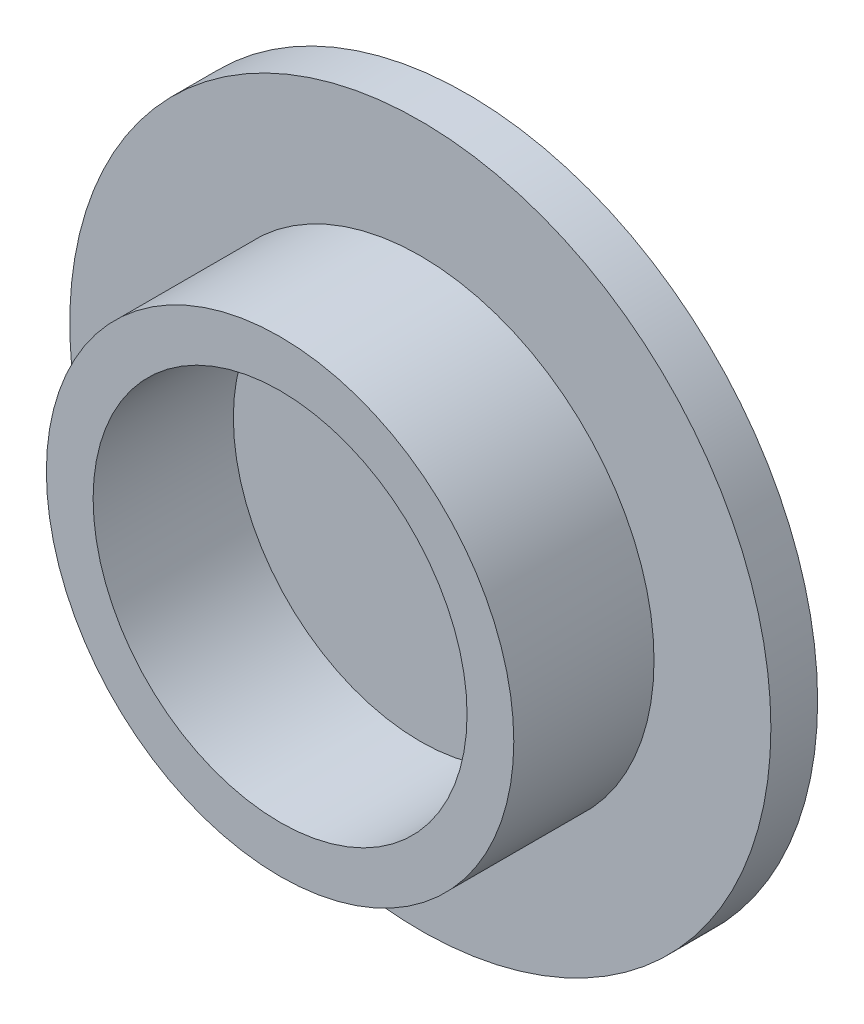
ISO-10303-21;
HEADER;
FILE_DESCRIPTION(('STEP AP214'),'2;1');
FILE_NAME('part.step','',(''),(''),'','','');
FILE_SCHEMA(('AUTOMOTIVE_DESIGN { 1 0 10303 214 1 1 1 1 }'));
ENDSEC;
DATA;
#1=APPLICATION_CONTEXT('core data for automotive mechanical design processes');
#2=APPLICATION_PROTOCOL_DEFINITION('international standard','automotive_design',2000,#1);
#3=PRODUCT_CONTEXT('',#1,'mechanical');
#4=PRODUCT('Part','Part','',(#3));
#5=PRODUCT_RELATED_PRODUCT_CATEGORY('part','',(#4));
#6=PRODUCT_DEFINITION_FORMATION('','',#4);
#7=PRODUCT_DEFINITION_CONTEXT('part definition',#1,'design');
#8=PRODUCT_DEFINITION('design','',#6,#7);
#9=PRODUCT_DEFINITION_SHAPE('','',#8);
#10=(LENGTH_UNIT() NAMED_UNIT(*) SI_UNIT(.MILLI.,.METRE.));
#11=(NAMED_UNIT(*) PLANE_ANGLE_UNIT() SI_UNIT($,.RADIAN.));
#12=(NAMED_UNIT(*) SI_UNIT($,.STERADIAN.) SOLID_ANGLE_UNIT());
#13=UNCERTAINTY_MEASURE_WITH_UNIT(LENGTH_MEASURE(1.E-05),#10,'distance_accuracy_value','');
#14=(GEOMETRIC_REPRESENTATION_CONTEXT(3) GLOBAL_UNCERTAINTY_ASSIGNED_CONTEXT((#13)) GLOBAL_UNIT_ASSIGNED_CONTEXT((#10,
#11,#12)) REPRESENTATION_CONTEXT('',''));
#15=CARTESIAN_POINT('',(0.,0.,0.));
#16=DIRECTION('',(0.,0.,1.));
#17=DIRECTION('',(1.,0.,0.));
#18=AXIS2_PLACEMENT_3D('',#15,#16,#17);
#19=CARTESIAN_POINT('',(0.,0.,-10.));
#20=DIRECTION('',(0.,0.,1.));
#21=DIRECTION('',(1.,0.,0.));
#22=AXIS2_PLACEMENT_3D('',#19,#20,#21);
#23=CYLINDRICAL_SURFACE('',#22,75.);
#24=CARTESIAN_POINT('',(0.,0.,-10.));
#25=DIRECTION('',(0.,0.,1.));
#26=DIRECTION('',(1.,0.,0.));
#27=AXIS2_PLACEMENT_3D('',#24,#25,#26);
#28=CIRCLE('',#27,75.);
#29=CARTESIAN_POINT('',(75.,0.,-10.));
#30=VERTEX_POINT('',#29);
#31=EDGE_CURVE('E11',#30,#30,#28,.T.);
#32=ORIENTED_EDGE('',*,*,#31,.T.);
#33=EDGE_LOOP('',(#32));
#34=FACE_BOUND('',#33,.T.);
#35=CARTESIAN_POINT('',(0.,0.,0.));
#36=DIRECTION('',(0.,0.,1.));
#37=DIRECTION('',(1.,0.,0.));
#38=AXIS2_PLACEMENT_3D('',#35,#36,#37);
#39=CIRCLE('',#38,75.);
#40=CARTESIAN_POINT('',(75.,0.,0.));
#41=VERTEX_POINT('',#40);
#42=EDGE_CURVE('E42',#41,#41,#39,.T.);
#43=ORIENTED_EDGE('',*,*,#42,.F.);
#44=EDGE_LOOP('',(#43));
#45=FACE_BOUND('',#44,.T.);
#46=ADVANCED_FACE('F39',(#34,#45),#23,.T.);
#47=CARTESIAN_POINT('',(0.,0.,-10.));
#48=DIRECTION('',(0.,0.,1.));
#49=DIRECTION('',(1.,0.,0.));
#50=AXIS2_PLACEMENT_3D('',#47,#48,#49);
#51=PLANE('',#50);
#52=ORIENTED_EDGE('',*,*,#31,.F.);
#53=EDGE_LOOP('',(#52));
#54=FACE_BOUND('',#53,.T.);
#55=ADVANCED_FACE('F54',(#54),#51,.F.);
#56=CARTESIAN_POINT('',(0.,0.,0.));
#57=DIRECTION('',(0.,0.,1.));
#58=DIRECTION('',(1.,0.,0.));
#59=AXIS2_PLACEMENT_3D('',#56,#57,#58);
#60=PLANE('',#59);
#61=ORIENTED_EDGE('',*,*,#42,.T.);
#62=EDGE_LOOP('',(#61));
#63=FACE_BOUND('',#62,.T.);
#64=ADVANCED_FACE('F51',(#63),#60,.T.);
#65=CLOSED_SHELL('',(#46,#55,#64));
#66=MANIFOLD_SOLID_BREP('B2',#65);
#67=CARTESIAN_POINT('',(0.,0.,30.));
#68=DIRECTION('',(0.,0.,1.));
#69=DIRECTION('',(1.,0.,0.));
#70=AXIS2_PLACEMENT_3D('',#67,#68,#69);
#71=PLANE('',#70);
#72=CARTESIAN_POINT('',(0.,0.,30.));
#73=DIRECTION('',(0.,0.,1.));
#74=DIRECTION('',(1.,0.,0.));
#75=AXIS2_PLACEMENT_3D('',#72,#73,#74);
#76=CIRCLE('',#75,50.);
#77=CARTESIAN_POINT('',(50.,0.,30.));
#78=VERTEX_POINT('',#77);
#79=EDGE_CURVE('E38',#78,#78,#76,.T.);
#80=ORIENTED_EDGE('',*,*,#79,.T.);
#81=EDGE_LOOP('',(#80));
#82=FACE_BOUND('',#81,.T.);
#83=CARTESIAN_POINT('',(0.,0.,30.));
#84=DIRECTION('',(0.,0.,1.));
#85=DIRECTION('',(1.,0.,0.));
#86=AXIS2_PLACEMENT_3D('',#83,#84,#85);
#87=CIRCLE('',#86,40.);
#88=CARTESIAN_POINT('',(40.,0.,30.));
#89=VERTEX_POINT('',#88);
#90=EDGE_CURVE('E91',#89,#89,#87,.T.);
#91=ORIENTED_EDGE('',*,*,#90,.F.);
#92=EDGE_LOOP('',(#91));
#93=FACE_BOUND('',#92,.T.);
#94=ADVANCED_FACE('F80',(#82,#93),#71,.T.);
#95=CARTESIAN_POINT('',(0.,0.,0.));
#96=DIRECTION('',(0.,0.,1.));
#97=DIRECTION('',(1.,0.,0.));
#98=AXIS2_PLACEMENT_3D('',#95,#96,#97);
#99=PLANE('',#98);
#100=CARTESIAN_POINT('',(0.,0.,0.));
#101=DIRECTION('',(0.,0.,1.));
#102=DIRECTION('',(1.,0.,0.));
#103=AXIS2_PLACEMENT_3D('',#100,#101,#102);
#104=CIRCLE('',#103,50.);
#105=CARTESIAN_POINT('',(50.,0.,0.));
#106=VERTEX_POINT('',#105);
#107=EDGE_CURVE('E84',#106,#106,#104,.T.);
#108=ORIENTED_EDGE('',*,*,#107,.F.);
#109=EDGE_LOOP('',(#108));
#110=FACE_BOUND('',#109,.T.);
#111=CARTESIAN_POINT('',(0.,0.,0.));
#112=DIRECTION('',(0.,0.,1.));
#113=DIRECTION('',(1.,0.,0.));
#114=AXIS2_PLACEMENT_3D('',#111,#112,#113);
#115=CIRCLE('',#114,40.);
#116=CARTESIAN_POINT('',(40.,0.,0.));
#117=VERTEX_POINT('',#116);
#118=EDGE_CURVE('E93',#117,#117,#115,.T.);
#119=ORIENTED_EDGE('',*,*,#118,.T.);
#120=EDGE_LOOP('',(#119));
#121=FACE_BOUND('',#120,.T.);
#122=ADVANCED_FACE('F103',(#110,#121),#99,.F.);
#123=CARTESIAN_POINT('',(0.,0.,30.));
#124=DIRECTION('',(0.,0.,-1.));
#125=DIRECTION('',(-1.,0.,0.));
#126=AXIS2_PLACEMENT_3D('',#123,#124,#125);
#127=CYLINDRICAL_SURFACE('',#126,50.);
#128=ORIENTED_EDGE('',*,*,#79,.F.);
#129=EDGE_LOOP('',(#128));
#130=FACE_BOUND('',#129,.T.);
#131=ORIENTED_EDGE('',*,*,#107,.T.);
#132=EDGE_LOOP('',(#131));
#133=FACE_BOUND('',#132,.T.);
#134=ADVANCED_FACE('F82',(#130,#133),#127,.T.);
#135=CARTESIAN_POINT('',(0.,0.,30.));
#136=DIRECTION('',(0.,0.,-1.));
#137=DIRECTION('',(-1.,0.,0.));
#138=AXIS2_PLACEMENT_3D('',#135,#136,#137);
#139=CYLINDRICAL_SURFACE('',#138,40.);
#140=ORIENTED_EDGE('',*,*,#90,.T.);
#141=EDGE_LOOP('',(#140));
#142=FACE_BOUND('',#141,.T.);
#143=ORIENTED_EDGE('',*,*,#118,.F.);
#144=EDGE_LOOP('',(#143));
#145=FACE_BOUND('',#144,.T.);
#146=ADVANCED_FACE('F99',(#142,#145),#139,.F.);
#147=CLOSED_SHELL('',(#94,#122,#134,#146));
#148=MANIFOLD_SOLID_BREP('B6',#147);
#149=ADVANCED_BREP_SHAPE_REPRESENTATION('',(#18,#66,#148),#14);
#150=SHAPE_DEFINITION_REPRESENTATION(#9,#149);
ENDSEC;
END-ISO-10303-21;
